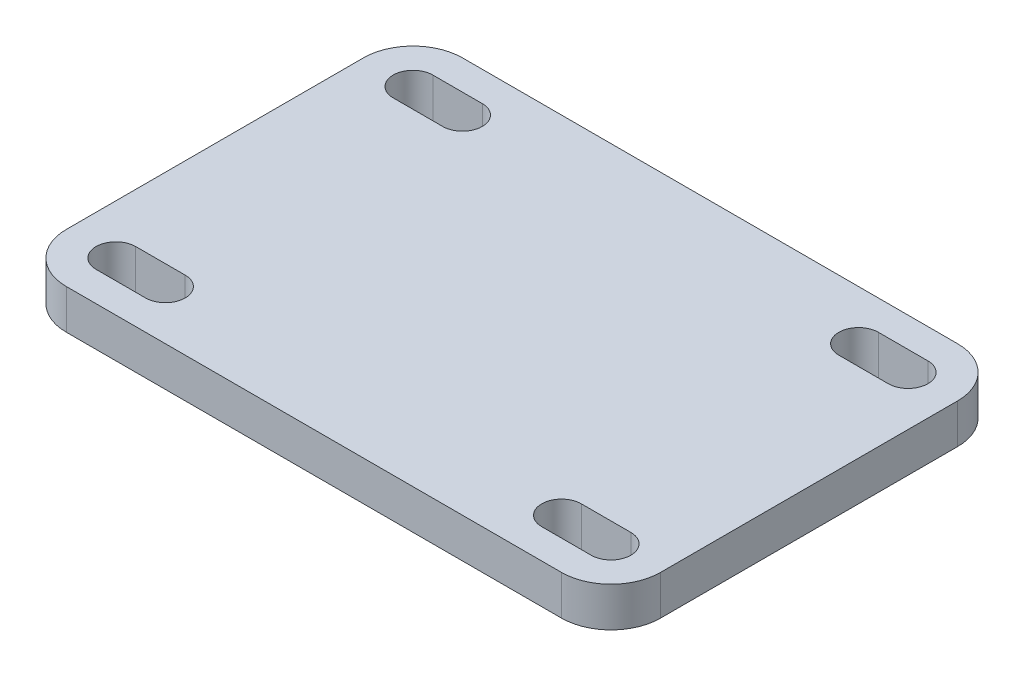
ISO-10303-21;
HEADER;
FILE_DESCRIPTION(('STEP AP214'),'2;1');
FILE_NAME('part.step','',(''),(''),'','','');
FILE_SCHEMA(('AUTOMOTIVE_DESIGN { 1 0 10303 214 1 1 1 1 }'));
ENDSEC;
DATA;
#1=APPLICATION_CONTEXT('core data for automotive mechanical design processes');
#2=APPLICATION_PROTOCOL_DEFINITION('international standard','automotive_design',2000,#1);
#3=PRODUCT_CONTEXT('',#1,'mechanical');
#4=PRODUCT('Part','Part','',(#3));
#5=PRODUCT_RELATED_PRODUCT_CATEGORY('part','',(#4));
#6=PRODUCT_DEFINITION_FORMATION('','',#4);
#7=PRODUCT_DEFINITION_CONTEXT('part definition',#1,'design');
#8=PRODUCT_DEFINITION('design','',#6,#7);
#9=PRODUCT_DEFINITION_SHAPE('','',#8);
#10=(LENGTH_UNIT() NAMED_UNIT(*) SI_UNIT(.MILLI.,.METRE.));
#11=(NAMED_UNIT(*) PLANE_ANGLE_UNIT() SI_UNIT($,.RADIAN.));
#12=(NAMED_UNIT(*) SI_UNIT($,.STERADIAN.) SOLID_ANGLE_UNIT());
#13=UNCERTAINTY_MEASURE_WITH_UNIT(LENGTH_MEASURE(1.E-05),#10,'distance_accuracy_value','');
#14=(GEOMETRIC_REPRESENTATION_CONTEXT(3) GLOBAL_UNCERTAINTY_ASSIGNED_CONTEXT((#13)) GLOBAL_UNIT_ASSIGNED_CONTEXT((#10,
#11,#12)) REPRESENTATION_CONTEXT('',''));
#15=CARTESIAN_POINT('',(0.,0.,0.));
#16=DIRECTION('',(0.,0.,1.));
#17=DIRECTION('',(1.,0.,0.));
#18=AXIS2_PLACEMENT_3D('',#15,#16,#17);
#19=CARTESIAN_POINT('',(-25.,4.,15.));
#20=DIRECTION('',(0.,-1.,0.));
#21=DIRECTION('',(0.,0.,-1.));
#22=AXIS2_PLACEMENT_3D('',#19,#20,#21);
#23=CYLINDRICAL_SURFACE('',#22,5.);
#24=CARTESIAN_POINT('',(-25.,0.,15.));
#25=DIRECTION('',(0.,1.,0.));
#26=DIRECTION('',(0.,0.,-1.));
#27=AXIS2_PLACEMENT_3D('',#24,#25,#26);
#28=CIRCLE('',#27,5.);
#29=CARTESIAN_POINT('',(-30.,0.,15.));
#30=VERTEX_POINT('',#29);
#31=CARTESIAN_POINT('',(-25.,0.,20.));
#32=VERTEX_POINT('',#31);
#33=EDGE_CURVE('E322',#30,#32,#28,.T.);
#34=ORIENTED_EDGE('',*,*,#33,.T.);
#35=DIRECTION('',(0.,-1.,0.));
#36=VECTOR('',#35,1.);
#37=CARTESIAN_POINT('',(-25.,4.,20.));
#38=LINE('',#37,#36);
#39=CARTESIAN_POINT('',(-25.,4.,20.));
#40=VERTEX_POINT('',#39);
#41=EDGE_CURVE('E11',#40,#32,#38,.T.);
#42=ORIENTED_EDGE('',*,*,#41,.F.);
#43=CARTESIAN_POINT('',(-25.,4.,15.));
#44=DIRECTION('',(0.,1.,0.));
#45=DIRECTION('',(0.,0.,-1.));
#46=AXIS2_PLACEMENT_3D('',#43,#44,#45);
#47=CIRCLE('',#46,5.);
#48=CARTESIAN_POINT('',(-30.,4.,15.));
#49=VERTEX_POINT('',#48);
#50=EDGE_CURVE('E329',#49,#40,#47,.T.);
#51=ORIENTED_EDGE('',*,*,#50,.F.);
#52=DIRECTION('',(0.,-1.,0.));
#53=VECTOR('',#52,1.);
#54=CARTESIAN_POINT('',(-30.,4.,15.));
#55=LINE('',#54,#53);
#56=EDGE_CURVE('E347',#49,#30,#55,.T.);
#57=ORIENTED_EDGE('',*,*,#56,.T.);
#58=EDGE_LOOP('',(#34,#42,#51,#57));
#59=FACE_BOUND('',#58,.T.);
#60=ADVANCED_FACE('F33',(#59),#23,.T.);
#61=CARTESIAN_POINT('',(25.,4.,20.));
#62=DIRECTION('',(0.,0.,-1.));
#63=DIRECTION('',(-1.,0.,0.));
#64=AXIS2_PLACEMENT_3D('',#61,#62,#63);
#65=PLANE('',#64);
#66=DIRECTION('',(1.,0.,0.));
#67=VECTOR('',#66,1.);
#68=CARTESIAN_POINT('',(25.,0.,20.));
#69=LINE('',#68,#67);
#70=CARTESIAN_POINT('',(25.,0.,20.));
#71=VERTEX_POINT('',#70);
#72=EDGE_CURVE('E350',#32,#71,#69,.T.);
#73=ORIENTED_EDGE('',*,*,#72,.T.);
#74=DIRECTION('',(0.,-1.,0.));
#75=VECTOR('',#74,1.);
#76=CARTESIAN_POINT('',(25.,4.,20.));
#77=LINE('',#76,#75);
#78=CARTESIAN_POINT('',(25.,4.,20.));
#79=VERTEX_POINT('',#78);
#80=EDGE_CURVE('E40',#79,#71,#77,.T.);
#81=ORIENTED_EDGE('',*,*,#80,.F.);
#82=DIRECTION('',(1.,0.,0.));
#83=VECTOR('',#82,1.);
#84=CARTESIAN_POINT('',(25.,4.,20.));
#85=LINE('',#84,#83);
#86=EDGE_CURVE('E332',#40,#79,#85,.T.);
#87=ORIENTED_EDGE('',*,*,#86,.F.);
#88=ORIENTED_EDGE('',*,*,#41,.T.);
#89=EDGE_LOOP('',(#73,#81,#87,#88));
#90=FACE_BOUND('',#89,.T.);
#91=ADVANCED_FACE('F406',(#90),#65,.F.);
#92=CARTESIAN_POINT('',(25.,4.,15.));
#93=DIRECTION('',(0.,-1.,0.));
#94=DIRECTION('',(0.,0.,-1.));
#95=AXIS2_PLACEMENT_3D('',#92,#93,#94);
#96=CYLINDRICAL_SURFACE('',#95,5.);
#97=CARTESIAN_POINT('',(25.,0.,15.));
#98=DIRECTION('',(0.,1.,0.));
#99=DIRECTION('',(0.,0.,1.));
#100=AXIS2_PLACEMENT_3D('',#97,#98,#99);
#101=CIRCLE('',#100,5.);
#102=CARTESIAN_POINT('',(30.,0.,15.));
#103=VERTEX_POINT('',#102);
#104=EDGE_CURVE('E352',#71,#103,#101,.T.);
#105=ORIENTED_EDGE('',*,*,#104,.T.);
#106=DIRECTION('',(0.,-1.,0.));
#107=VECTOR('',#106,1.);
#108=CARTESIAN_POINT('',(30.,4.,15.));
#109=LINE('',#108,#107);
#110=CARTESIAN_POINT('',(30.,4.,15.));
#111=VERTEX_POINT('',#110);
#112=EDGE_CURVE('E377',#111,#103,#109,.T.);
#113=ORIENTED_EDGE('',*,*,#112,.F.);
#114=CARTESIAN_POINT('',(25.,4.,15.));
#115=DIRECTION('',(0.,1.,0.));
#116=DIRECTION('',(0.,0.,1.));
#117=AXIS2_PLACEMENT_3D('',#114,#115,#116);
#118=CIRCLE('',#117,5.);
#119=EDGE_CURVE('E335',#79,#111,#118,.T.);
#120=ORIENTED_EDGE('',*,*,#119,.F.);
#121=ORIENTED_EDGE('',*,*,#80,.T.);
#122=EDGE_LOOP('',(#105,#113,#120,#121));
#123=FACE_BOUND('',#122,.T.);
#124=ADVANCED_FACE('F384',(#123),#96,.T.);
#125=CARTESIAN_POINT('',(30.,4.,15.));
#126=DIRECTION('',(-1.,0.,0.));
#127=DIRECTION('',(0.,0.,1.));
#128=AXIS2_PLACEMENT_3D('',#125,#126,#127);
#129=PLANE('',#128);
#130=DIRECTION('',(0.,0.,-1.));
#131=VECTOR('',#130,1.);
#132=CARTESIAN_POINT('',(30.,0.,15.));
#133=LINE('',#132,#131);
#134=CARTESIAN_POINT('',(30.,0.,-15.));
#135=VERTEX_POINT('',#134);
#136=EDGE_CURVE('E354',#103,#135,#133,.T.);
#137=ORIENTED_EDGE('',*,*,#136,.T.);
#138=DIRECTION('',(0.,-1.,0.));
#139=VECTOR('',#138,1.);
#140=CARTESIAN_POINT('',(30.,4.,-15.));
#141=LINE('',#140,#139);
#142=CARTESIAN_POINT('',(30.,4.,-15.));
#143=VERTEX_POINT('',#142);
#144=EDGE_CURVE('E374',#143,#135,#141,.T.);
#145=ORIENTED_EDGE('',*,*,#144,.F.);
#146=DIRECTION('',(0.,0.,-1.));
#147=VECTOR('',#146,1.);
#148=CARTESIAN_POINT('',(30.,4.,15.));
#149=LINE('',#148,#147);
#150=EDGE_CURVE('E337',#111,#143,#149,.T.);
#151=ORIENTED_EDGE('',*,*,#150,.F.);
#152=ORIENTED_EDGE('',*,*,#112,.T.);
#153=EDGE_LOOP('',(#137,#145,#151,#152));
#154=FACE_BOUND('',#153,.T.);
#155=ADVANCED_FACE('F394',(#154),#129,.F.);
#156=CARTESIAN_POINT('',(25.,4.,-15.));
#157=DIRECTION('',(0.,-1.,0.));
#158=DIRECTION('',(0.,0.,-1.));
#159=AXIS2_PLACEMENT_3D('',#156,#157,#158);
#160=CYLINDRICAL_SURFACE('',#159,5.);
#161=CARTESIAN_POINT('',(25.,0.,-15.));
#162=DIRECTION('',(0.,1.,0.));
#163=DIRECTION('',(0.,0.,1.));
#164=AXIS2_PLACEMENT_3D('',#161,#162,#163);
#165=CIRCLE('',#164,5.);
#166=CARTESIAN_POINT('',(25.,0.,-20.));
#167=VERTEX_POINT('',#166);
#168=EDGE_CURVE('E356',#135,#167,#165,.T.);
#169=ORIENTED_EDGE('',*,*,#168,.T.);
#170=DIRECTION('',(0.,-1.,0.));
#171=VECTOR('',#170,1.);
#172=CARTESIAN_POINT('',(25.,4.,-20.));
#173=LINE('',#172,#171);
#174=CARTESIAN_POINT('',(25.,4.,-20.));
#175=VERTEX_POINT('',#174);
#176=EDGE_CURVE('E371',#175,#167,#173,.T.);
#177=ORIENTED_EDGE('',*,*,#176,.F.);
#178=CARTESIAN_POINT('',(25.,4.,-15.));
#179=DIRECTION('',(0.,1.,0.));
#180=DIRECTION('',(0.,0.,1.));
#181=AXIS2_PLACEMENT_3D('',#178,#179,#180);
#182=CIRCLE('',#181,5.);
#183=EDGE_CURVE('E339',#143,#175,#182,.T.);
#184=ORIENTED_EDGE('',*,*,#183,.F.);
#185=ORIENTED_EDGE('',*,*,#144,.T.);
#186=EDGE_LOOP('',(#169,#177,#184,#185));
#187=FACE_BOUND('',#186,.T.);
#188=ADVANCED_FACE('F398',(#187),#160,.T.);
#189=CARTESIAN_POINT('',(25.,4.,-20.));
#190=DIRECTION('',(0.,0.,1.));
#191=DIRECTION('',(1.,0.,0.));
#192=AXIS2_PLACEMENT_3D('',#189,#190,#191);
#193=PLANE('',#192);
#194=DIRECTION('',(-1.,0.,0.));
#195=VECTOR('',#194,1.);
#196=CARTESIAN_POINT('',(25.,0.,-20.));
#197=LINE('',#196,#195);
#198=CARTESIAN_POINT('',(-25.,0.,-20.));
#199=VERTEX_POINT('',#198);
#200=EDGE_CURVE('E358',#167,#199,#197,.T.);
#201=ORIENTED_EDGE('',*,*,#200,.T.);
#202=DIRECTION('',(0.,-1.,0.));
#203=VECTOR('',#202,1.);
#204=CARTESIAN_POINT('',(-25.,4.,-20.));
#205=LINE('',#204,#203);
#206=CARTESIAN_POINT('',(-25.,4.,-20.));
#207=VERTEX_POINT('',#206);
#208=EDGE_CURVE('E368',#207,#199,#205,.T.);
#209=ORIENTED_EDGE('',*,*,#208,.F.);
#210=DIRECTION('',(-1.,0.,0.));
#211=VECTOR('',#210,1.);
#212=CARTESIAN_POINT('',(25.,4.,-20.));
#213=LINE('',#212,#211);
#214=EDGE_CURVE('E341',#175,#207,#213,.T.);
#215=ORIENTED_EDGE('',*,*,#214,.F.);
#216=ORIENTED_EDGE('',*,*,#176,.T.);
#217=EDGE_LOOP('',(#201,#209,#215,#216));
#218=FACE_BOUND('',#217,.T.);
#219=ADVANCED_FACE('F419',(#218),#193,.F.);
#220=CARTESIAN_POINT('',(-25.,4.,-15.));
#221=DIRECTION('',(0.,-1.,0.));
#222=DIRECTION('',(0.,0.,-1.));
#223=AXIS2_PLACEMENT_3D('',#220,#221,#222);
#224=CYLINDRICAL_SURFACE('',#223,5.);
#225=CARTESIAN_POINT('',(-25.,0.,-15.));
#226=DIRECTION('',(0.,1.,0.));
#227=DIRECTION('',(0.,0.,1.));
#228=AXIS2_PLACEMENT_3D('',#225,#226,#227);
#229=CIRCLE('',#228,5.);
#230=CARTESIAN_POINT('',(-30.,0.,-15.));
#231=VERTEX_POINT('',#230);
#232=EDGE_CURVE('E360',#199,#231,#229,.T.);
#233=ORIENTED_EDGE('',*,*,#232,.T.);
#234=DIRECTION('',(0.,-1.,0.));
#235=VECTOR('',#234,1.);
#236=CARTESIAN_POINT('',(-30.,4.,-15.));
#237=LINE('',#236,#235);
#238=CARTESIAN_POINT('',(-30.,4.,-15.));
#239=VERTEX_POINT('',#238);
#240=EDGE_CURVE('E365',#239,#231,#237,.T.);
#241=ORIENTED_EDGE('',*,*,#240,.F.);
#242=CARTESIAN_POINT('',(-25.,4.,-15.));
#243=DIRECTION('',(0.,1.,0.));
#244=DIRECTION('',(0.,0.,1.));
#245=AXIS2_PLACEMENT_3D('',#242,#243,#244);
#246=CIRCLE('',#245,5.);
#247=EDGE_CURVE('E343',#207,#239,#246,.T.);
#248=ORIENTED_EDGE('',*,*,#247,.F.);
#249=ORIENTED_EDGE('',*,*,#208,.T.);
#250=EDGE_LOOP('',(#233,#241,#248,#249));
#251=FACE_BOUND('',#250,.T.);
#252=ADVANCED_FACE('F417',(#251),#224,.T.);
#253=CARTESIAN_POINT('',(-30.,4.,15.));
#254=DIRECTION('',(1.,0.,0.));
#255=DIRECTION('',(0.,0.,-1.));
#256=AXIS2_PLACEMENT_3D('',#253,#254,#255);
#257=PLANE('',#256);
#258=DIRECTION('',(0.,0.,1.));
#259=VECTOR('',#258,1.);
#260=CARTESIAN_POINT('',(-30.,0.,15.));
#261=LINE('',#260,#259);
#262=EDGE_CURVE('E333',#231,#30,#261,.T.);
#263=ORIENTED_EDGE('',*,*,#262,.T.);
#264=ORIENTED_EDGE('',*,*,#56,.F.);
#265=DIRECTION('',(0.,0.,1.));
#266=VECTOR('',#265,1.);
#267=CARTESIAN_POINT('',(-30.,4.,15.));
#268=LINE('',#267,#266);
#269=EDGE_CURVE('E345',#239,#49,#268,.T.);
#270=ORIENTED_EDGE('',*,*,#269,.F.);
#271=ORIENTED_EDGE('',*,*,#240,.T.);
#272=EDGE_LOOP('',(#263,#264,#270,#271));
#273=FACE_BOUND('',#272,.T.);
#274=ADVANCED_FACE('F412',(#273),#257,.F.);
#275=CARTESIAN_POINT('',(-25.,4.,15.));
#276=DIRECTION('',(0.,-1.,0.));
#277=DIRECTION('',(0.,0.,-1.));
#278=AXIS2_PLACEMENT_3D('',#275,#276,#277);
#279=PLANE('',#278);
#280=DIRECTION('',(1.,0.,0.));
#281=VECTOR('',#280,1.);
#282=CARTESIAN_POINT('',(-25.,4.,17.));
#283=LINE('',#282,#281);
#284=CARTESIAN_POINT('',(-25.,4.,17.));
#285=VERTEX_POINT('',#284);
#286=CARTESIAN_POINT('',(-20.,4.,17.));
#287=VERTEX_POINT('',#286);
#288=EDGE_CURVE('E283',#285,#287,#283,.T.);
#289=ORIENTED_EDGE('',*,*,#288,.F.);
#290=CARTESIAN_POINT('',(-25.,4.,15.));
#291=DIRECTION('',(0.,1.,0.));
#292=DIRECTION('',(0.,0.,-1.));
#293=AXIS2_PLACEMENT_3D('',#290,#291,#292);
#294=CIRCLE('',#293,2.);
#295=CARTESIAN_POINT('',(-25.,4.,13.));
#296=VERTEX_POINT('',#295);
#297=EDGE_CURVE('E47',#296,#285,#294,.T.);
#298=ORIENTED_EDGE('',*,*,#297,.F.);
#299=DIRECTION('',(-1.,0.,0.));
#300=VECTOR('',#299,1.);
#301=CARTESIAN_POINT('',(-25.,4.,13.));
#302=LINE('',#301,#300);
#303=CARTESIAN_POINT('',(-20.,4.,13.));
#304=VERTEX_POINT('',#303);
#305=EDGE_CURVE('E272',#304,#296,#302,.T.);
#306=ORIENTED_EDGE('',*,*,#305,.F.);
#307=CARTESIAN_POINT('',(-20.,4.,15.));
#308=DIRECTION('',(0.,1.,0.));
#309=DIRECTION('',(0.,0.,-1.));
#310=AXIS2_PLACEMENT_3D('',#307,#308,#309);
#311=CIRCLE('',#310,2.);
#312=EDGE_CURVE('E286',#287,#304,#311,.T.);
#313=ORIENTED_EDGE('',*,*,#312,.F.);
#314=EDGE_LOOP('',(#289,#298,#306,#313));
#315=FACE_BOUND('',#314,.T.);
#316=DIRECTION('',(-1.,0.,0.));
#317=VECTOR('',#316,1.);
#318=CARTESIAN_POINT('',(25.,4.,13.));
#319=LINE('',#318,#317);
#320=CARTESIAN_POINT('',(25.,4.,13.));
#321=VERTEX_POINT('',#320);
#322=CARTESIAN_POINT('',(20.,4.,13.));
#323=VERTEX_POINT('',#322);
#324=EDGE_CURVE('E253',#321,#323,#319,.T.);
#325=ORIENTED_EDGE('',*,*,#324,.F.);
#326=CARTESIAN_POINT('',(25.,4.,15.));
#327=DIRECTION('',(0.,1.,0.));
#328=DIRECTION('',(0.,0.,1.));
#329=AXIS2_PLACEMENT_3D('',#326,#327,#328);
#330=CIRCLE('',#329,2.);
#331=CARTESIAN_POINT('',(25.,4.,17.));
#332=VERTEX_POINT('',#331);
#333=EDGE_CURVE('E55',#332,#321,#330,.T.);
#334=ORIENTED_EDGE('',*,*,#333,.F.);
#335=DIRECTION('',(1.,0.,0.));
#336=VECTOR('',#335,1.);
#337=CARTESIAN_POINT('',(25.,4.,17.));
#338=LINE('',#337,#336);
#339=CARTESIAN_POINT('',(20.,4.,17.));
#340=VERTEX_POINT('',#339);
#341=EDGE_CURVE('E242',#340,#332,#338,.T.);
#342=ORIENTED_EDGE('',*,*,#341,.F.);
#343=CARTESIAN_POINT('',(20.,4.,15.));
#344=DIRECTION('',(0.,1.,0.));
#345=DIRECTION('',(0.,0.,1.));
#346=AXIS2_PLACEMENT_3D('',#343,#344,#345);
#347=CIRCLE('',#346,2.);
#348=EDGE_CURVE('E257',#323,#340,#347,.T.);
#349=ORIENTED_EDGE('',*,*,#348,.F.);
#350=EDGE_LOOP('',(#325,#334,#342,#349));
#351=FACE_BOUND('',#350,.T.);
#352=DIRECTION('',(-1.,0.,0.));
#353=VECTOR('',#352,1.);
#354=CARTESIAN_POINT('',(25.,4.,-17.));
#355=LINE('',#354,#353);
#356=CARTESIAN_POINT('',(25.,4.,-17.));
#357=VERTEX_POINT('',#356);
#358=CARTESIAN_POINT('',(20.,4.,-17.));
#359=VERTEX_POINT('',#358);
#360=EDGE_CURVE('E227',#357,#359,#355,.T.);
#361=ORIENTED_EDGE('',*,*,#360,.F.);
#362=CARTESIAN_POINT('',(25.,4.,-15.));
#363=DIRECTION('',(0.,1.,0.));
#364=DIRECTION('',(0.,0.,-1.));
#365=AXIS2_PLACEMENT_3D('',#362,#363,#364);
#366=CIRCLE('',#365,2.);
#367=CARTESIAN_POINT('',(25.,4.,-13.));
#368=VERTEX_POINT('',#367);
#369=EDGE_CURVE('E200',#368,#357,#366,.T.);
#370=ORIENTED_EDGE('',*,*,#369,.F.);
#371=DIRECTION('',(1.,0.,0.));
#372=VECTOR('',#371,1.);
#373=CARTESIAN_POINT('',(25.,4.,-13.));
#374=LINE('',#373,#372);
#375=CARTESIAN_POINT('',(20.,4.,-13.));
#376=VERTEX_POINT('',#375);
#377=EDGE_CURVE('E218',#376,#368,#374,.T.);
#378=ORIENTED_EDGE('',*,*,#377,.F.);
#379=CARTESIAN_POINT('',(20.,4.,-15.));
#380=DIRECTION('',(0.,1.,0.));
#381=DIRECTION('',(0.,0.,-1.));
#382=AXIS2_PLACEMENT_3D('',#379,#380,#381);
#383=CIRCLE('',#382,2.);
#384=EDGE_CURVE('E221',#359,#376,#383,.T.);
#385=ORIENTED_EDGE('',*,*,#384,.F.);
#386=EDGE_LOOP('',(#361,#370,#378,#385));
#387=FACE_BOUND('',#386,.T.);
#388=DIRECTION('',(1.,0.,0.));
#389=VECTOR('',#388,1.);
#390=CARTESIAN_POINT('',(-25.,4.,-13.));
#391=LINE('',#390,#389);
#392=CARTESIAN_POINT('',(-25.,4.,-13.));
#393=VERTEX_POINT('',#392);
#394=CARTESIAN_POINT('',(-20.,4.,-13.));
#395=VERTEX_POINT('',#394);
#396=EDGE_CURVE('E312',#393,#395,#391,.T.);
#397=ORIENTED_EDGE('',*,*,#396,.F.);
#398=CARTESIAN_POINT('',(-25.,4.,-15.));
#399=DIRECTION('',(0.,1.,0.));
#400=DIRECTION('',(0.,0.,1.));
#401=AXIS2_PLACEMENT_3D('',#398,#399,#400);
#402=CIRCLE('',#401,2.);
#403=CARTESIAN_POINT('',(-25.,4.,-17.));
#404=VERTEX_POINT('',#403);
#405=EDGE_CURVE('E234',#404,#393,#402,.T.);
#406=ORIENTED_EDGE('',*,*,#405,.F.);
#407=DIRECTION('',(-1.,0.,0.));
#408=VECTOR('',#407,1.);
#409=CARTESIAN_POINT('',(-25.,4.,-17.));
#410=LINE('',#409,#408);
#411=CARTESIAN_POINT('',(-20.,4.,-17.));
#412=VERTEX_POINT('',#411);
#413=EDGE_CURVE('E301',#412,#404,#410,.T.);
#414=ORIENTED_EDGE('',*,*,#413,.F.);
#415=CARTESIAN_POINT('',(-20.,4.,-15.));
#416=DIRECTION('',(0.,1.,0.));
#417=DIRECTION('',(0.,0.,1.));
#418=AXIS2_PLACEMENT_3D('',#415,#416,#417);
#419=CIRCLE('',#418,2.);
#420=EDGE_CURVE('E315',#395,#412,#419,.T.);
#421=ORIENTED_EDGE('',*,*,#420,.F.);
#422=EDGE_LOOP('',(#397,#406,#414,#421));
#423=FACE_BOUND('',#422,.T.);
#424=ORIENTED_EDGE('',*,*,#50,.T.);
#425=ORIENTED_EDGE('',*,*,#86,.T.);
#426=ORIENTED_EDGE('',*,*,#119,.T.);
#427=ORIENTED_EDGE('',*,*,#150,.T.);
#428=ORIENTED_EDGE('',*,*,#183,.T.);
#429=ORIENTED_EDGE('',*,*,#214,.T.);
#430=ORIENTED_EDGE('',*,*,#247,.T.);
#431=ORIENTED_EDGE('',*,*,#269,.T.);
#432=EDGE_LOOP('',(#424,#425,#426,#427,#428,#429,#430,#431));
#433=FACE_BOUND('',#432,.T.);
#434=ADVANCED_FACE('F402',(#315,#351,#387,#423,#433),#279,.F.);
#435=CARTESIAN_POINT('',(-25.,0.,15.));
#436=DIRECTION('',(0.,-1.,0.));
#437=DIRECTION('',(0.,0.,-1.));
#438=AXIS2_PLACEMENT_3D('',#435,#436,#437);
#439=PLANE('',#438);
#440=CARTESIAN_POINT('',(-25.,0.,15.));
#441=DIRECTION('',(0.,1.,0.));
#442=DIRECTION('',(0.,0.,-1.));
#443=AXIS2_PLACEMENT_3D('',#440,#441,#442);
#444=CIRCLE('',#443,2.);
#445=CARTESIAN_POINT('',(-25.,0.,13.));
#446=VERTEX_POINT('',#445);
#447=CARTESIAN_POINT('',(-25.,0.,17.));
#448=VERTEX_POINT('',#447);
#449=EDGE_CURVE('E268',#446,#448,#444,.T.);
#450=ORIENTED_EDGE('',*,*,#449,.T.);
#451=DIRECTION('',(1.,0.,0.));
#452=VECTOR('',#451,1.);
#453=CARTESIAN_POINT('',(-25.,0.,17.));
#454=LINE('',#453,#452);
#455=CARTESIAN_POINT('',(-20.,0.,17.));
#456=VERTEX_POINT('',#455);
#457=EDGE_CURVE('E271',#448,#456,#454,.T.);
#458=ORIENTED_EDGE('',*,*,#457,.T.);
#459=CARTESIAN_POINT('',(-20.,0.,15.));
#460=DIRECTION('',(0.,1.,0.));
#461=DIRECTION('',(0.,0.,-1.));
#462=AXIS2_PLACEMENT_3D('',#459,#460,#461);
#463=CIRCLE('',#462,2.);
#464=CARTESIAN_POINT('',(-20.,0.,13.));
#465=VERTEX_POINT('',#464);
#466=EDGE_CURVE('E275',#456,#465,#463,.T.);
#467=ORIENTED_EDGE('',*,*,#466,.T.);
#468=DIRECTION('',(-1.,0.,0.));
#469=VECTOR('',#468,1.);
#470=CARTESIAN_POINT('',(-25.,0.,13.));
#471=LINE('',#470,#469);
#472=EDGE_CURVE('E278',#465,#446,#471,.T.);
#473=ORIENTED_EDGE('',*,*,#472,.T.);
#474=EDGE_LOOP('',(#450,#458,#467,#473));
#475=FACE_BOUND('',#474,.T.);
#476=CARTESIAN_POINT('',(25.,0.,15.));
#477=DIRECTION('',(0.,1.,0.));
#478=DIRECTION('',(0.,0.,1.));
#479=AXIS2_PLACEMENT_3D('',#476,#477,#478);
#480=CIRCLE('',#479,2.);
#481=CARTESIAN_POINT('',(25.,0.,17.));
#482=VERTEX_POINT('',#481);
#483=CARTESIAN_POINT('',(25.,0.,13.));
#484=VERTEX_POINT('',#483);
#485=EDGE_CURVE('E238',#482,#484,#480,.T.);
#486=ORIENTED_EDGE('',*,*,#485,.T.);
#487=DIRECTION('',(-1.,0.,0.));
#488=VECTOR('',#487,1.);
#489=CARTESIAN_POINT('',(25.,0.,13.));
#490=LINE('',#489,#488);
#491=CARTESIAN_POINT('',(20.,0.,13.));
#492=VERTEX_POINT('',#491);
#493=EDGE_CURVE('E241',#484,#492,#490,.T.);
#494=ORIENTED_EDGE('',*,*,#493,.T.);
#495=CARTESIAN_POINT('',(20.,0.,15.));
#496=DIRECTION('',(0.,1.,0.));
#497=DIRECTION('',(0.,0.,1.));
#498=AXIS2_PLACEMENT_3D('',#495,#496,#497);
#499=CIRCLE('',#498,2.);
#500=CARTESIAN_POINT('',(20.,0.,17.));
#501=VERTEX_POINT('',#500);
#502=EDGE_CURVE('E245',#492,#501,#499,.T.);
#503=ORIENTED_EDGE('',*,*,#502,.T.);
#504=DIRECTION('',(1.,0.,0.));
#505=VECTOR('',#504,1.);
#506=CARTESIAN_POINT('',(25.,0.,17.));
#507=LINE('',#506,#505);
#508=EDGE_CURVE('E248',#501,#482,#507,.T.);
#509=ORIENTED_EDGE('',*,*,#508,.T.);
#510=EDGE_LOOP('',(#486,#494,#503,#509));
#511=FACE_BOUND('',#510,.T.);
#512=CARTESIAN_POINT('',(25.,0.,-15.));
#513=DIRECTION('',(0.,1.,0.));
#514=DIRECTION('',(0.,0.,-1.));
#515=AXIS2_PLACEMENT_3D('',#512,#513,#514);
#516=CIRCLE('',#515,2.);
#517=CARTESIAN_POINT('',(25.,0.,-13.));
#518=VERTEX_POINT('',#517);
#519=CARTESIAN_POINT('',(25.,0.,-17.));
#520=VERTEX_POINT('',#519);
#521=EDGE_CURVE('E197',#518,#520,#516,.T.);
#522=ORIENTED_EDGE('',*,*,#521,.T.);
#523=DIRECTION('',(-1.,0.,0.));
#524=VECTOR('',#523,1.);
#525=CARTESIAN_POINT('',(25.,0.,-17.));
#526=LINE('',#525,#524);
#527=CARTESIAN_POINT('',(20.,0.,-17.));
#528=VERTEX_POINT('',#527);
#529=EDGE_CURVE('E209',#520,#528,#526,.T.);
#530=ORIENTED_EDGE('',*,*,#529,.T.);
#531=CARTESIAN_POINT('',(20.,0.,-15.));
#532=DIRECTION('',(0.,1.,0.));
#533=DIRECTION('',(0.,0.,-1.));
#534=AXIS2_PLACEMENT_3D('',#531,#532,#533);
#535=CIRCLE('',#534,2.);
#536=CARTESIAN_POINT('',(20.,0.,-13.));
#537=VERTEX_POINT('',#536);
#538=EDGE_CURVE('E213',#528,#537,#535,.T.);
#539=ORIENTED_EDGE('',*,*,#538,.T.);
#540=DIRECTION('',(1.,0.,0.));
#541=VECTOR('',#540,1.);
#542=CARTESIAN_POINT('',(25.,0.,-13.));
#543=LINE('',#542,#541);
#544=EDGE_CURVE('E205',#537,#518,#543,.T.);
#545=ORIENTED_EDGE('',*,*,#544,.T.);
#546=EDGE_LOOP('',(#522,#530,#539,#545));
#547=FACE_BOUND('',#546,.T.);
#548=CARTESIAN_POINT('',(-25.,0.,-15.));
#549=DIRECTION('',(0.,1.,0.));
#550=DIRECTION('',(0.,0.,1.));
#551=AXIS2_PLACEMENT_3D('',#548,#549,#550);
#552=CIRCLE('',#551,2.);
#553=CARTESIAN_POINT('',(-25.,0.,-17.));
#554=VERTEX_POINT('',#553);
#555=CARTESIAN_POINT('',(-25.,0.,-13.));
#556=VERTEX_POINT('',#555);
#557=EDGE_CURVE('E297',#554,#556,#552,.T.);
#558=ORIENTED_EDGE('',*,*,#557,.T.);
#559=DIRECTION('',(1.,0.,0.));
#560=VECTOR('',#559,1.);
#561=CARTESIAN_POINT('',(-25.,0.,-13.));
#562=LINE('',#561,#560);
#563=CARTESIAN_POINT('',(-20.,0.,-13.));
#564=VERTEX_POINT('',#563);
#565=EDGE_CURVE('E300',#556,#564,#562,.T.);
#566=ORIENTED_EDGE('',*,*,#565,.T.);
#567=CARTESIAN_POINT('',(-20.,0.,-15.));
#568=DIRECTION('',(0.,1.,0.));
#569=DIRECTION('',(0.,0.,1.));
#570=AXIS2_PLACEMENT_3D('',#567,#568,#569);
#571=CIRCLE('',#570,2.);
#572=CARTESIAN_POINT('',(-20.,0.,-17.));
#573=VERTEX_POINT('',#572);
#574=EDGE_CURVE('E304',#564,#573,#571,.T.);
#575=ORIENTED_EDGE('',*,*,#574,.T.);
#576=DIRECTION('',(-1.,0.,0.));
#577=VECTOR('',#576,1.);
#578=CARTESIAN_POINT('',(-25.,0.,-17.));
#579=LINE('',#578,#577);
#580=EDGE_CURVE('E307',#573,#554,#579,.T.);
#581=ORIENTED_EDGE('',*,*,#580,.T.);
#582=EDGE_LOOP('',(#558,#566,#575,#581));
#583=FACE_BOUND('',#582,.T.);
#584=ORIENTED_EDGE('',*,*,#33,.F.);
#585=ORIENTED_EDGE('',*,*,#262,.F.);
#586=ORIENTED_EDGE('',*,*,#232,.F.);
#587=ORIENTED_EDGE('',*,*,#200,.F.);
#588=ORIENTED_EDGE('',*,*,#168,.F.);
#589=ORIENTED_EDGE('',*,*,#136,.F.);
#590=ORIENTED_EDGE('',*,*,#104,.F.);
#591=ORIENTED_EDGE('',*,*,#72,.F.);
#592=EDGE_LOOP('',(#584,#585,#586,#587,#588,#589,#590,#591));
#593=FACE_BOUND('',#592,.T.);
#594=ADVANCED_FACE('F215',(#475,#511,#547,#583,#593),#439,.T.);
#595=CARTESIAN_POINT('',(-25.,0.,-15.));
#596=DIRECTION('',(0.,1.,0.));
#597=DIRECTION('',(0.,0.,1.));
#598=AXIS2_PLACEMENT_3D('',#595,#596,#597);
#599=CYLINDRICAL_SURFACE('',#598,2.);
#600=ORIENTED_EDGE('',*,*,#405,.T.);
#601=DIRECTION('',(0.,1.,0.));
#602=VECTOR('',#601,1.);
#603=CARTESIAN_POINT('',(-25.,0.,-13.));
#604=LINE('',#603,#602);
#605=EDGE_CURVE('E310',#556,#393,#604,.T.);
#606=ORIENTED_EDGE('',*,*,#605,.F.);
#607=ORIENTED_EDGE('',*,*,#557,.F.);
#608=DIRECTION('',(0.,1.,0.));
#609=VECTOR('',#608,1.);
#610=CARTESIAN_POINT('',(-25.,0.,-17.));
#611=LINE('',#610,#609);
#612=EDGE_CURVE('E320',#554,#404,#611,.T.);
#613=ORIENTED_EDGE('',*,*,#612,.T.);
#614=EDGE_LOOP('',(#600,#606,#607,#613));
#615=FACE_BOUND('',#614,.T.);
#616=ADVANCED_FACE('F482',(#615),#599,.F.);
#617=CARTESIAN_POINT('',(-25.,0.,-17.));
#618=DIRECTION('',(0.,0.,-1.));
#619=DIRECTION('',(-1.,0.,0.));
#620=AXIS2_PLACEMENT_3D('',#617,#618,#619);
#621=PLANE('',#620);
#622=ORIENTED_EDGE('',*,*,#413,.T.);
#623=ORIENTED_EDGE('',*,*,#612,.F.);
#624=ORIENTED_EDGE('',*,*,#580,.F.);
#625=DIRECTION('',(0.,1.,0.));
#626=VECTOR('',#625,1.);
#627=CARTESIAN_POINT('',(-20.,0.,-17.));
#628=LINE('',#627,#626);
#629=EDGE_CURVE('E323',#573,#412,#628,.T.);
#630=ORIENTED_EDGE('',*,*,#629,.T.);
#631=EDGE_LOOP('',(#622,#623,#624,#630));
#632=FACE_BOUND('',#631,.T.);
#633=ADVANCED_FACE('F492',(#632),#621,.F.);
#634=CARTESIAN_POINT('',(-20.,0.,-15.));
#635=DIRECTION('',(0.,1.,0.));
#636=DIRECTION('',(0.,0.,1.));
#637=AXIS2_PLACEMENT_3D('',#634,#635,#636);
#638=CYLINDRICAL_SURFACE('',#637,2.);
#639=ORIENTED_EDGE('',*,*,#420,.T.);
#640=ORIENTED_EDGE('',*,*,#629,.F.);
#641=ORIENTED_EDGE('',*,*,#574,.F.);
#642=DIRECTION('',(0.,1.,0.));
#643=VECTOR('',#642,1.);
#644=CARTESIAN_POINT('',(-20.,0.,-13.));
#645=LINE('',#644,#643);
#646=EDGE_CURVE('E325',#564,#395,#645,.T.);
#647=ORIENTED_EDGE('',*,*,#646,.T.);
#648=EDGE_LOOP('',(#639,#640,#641,#647));
#649=FACE_BOUND('',#648,.T.);
#650=ADVANCED_FACE('F502',(#649),#638,.F.);
#651=CARTESIAN_POINT('',(-25.,0.,-13.));
#652=DIRECTION('',(0.,0.,1.));
#653=DIRECTION('',(1.,0.,0.));
#654=AXIS2_PLACEMENT_3D('',#651,#652,#653);
#655=PLANE('',#654);
#656=ORIENTED_EDGE('',*,*,#396,.T.);
#657=ORIENTED_EDGE('',*,*,#646,.F.);
#658=ORIENTED_EDGE('',*,*,#565,.F.);
#659=ORIENTED_EDGE('',*,*,#605,.T.);
#660=EDGE_LOOP('',(#656,#657,#658,#659));
#661=FACE_BOUND('',#660,.T.);
#662=ADVANCED_FACE('F512',(#661),#655,.F.);
#663=CARTESIAN_POINT('',(25.,0.,-15.));
#664=DIRECTION('',(0.,1.,0.));
#665=DIRECTION('',(0.,0.,1.));
#666=AXIS2_PLACEMENT_3D('',#663,#664,#665);
#667=CYLINDRICAL_SURFACE('',#666,2.);
#668=ORIENTED_EDGE('',*,*,#369,.T.);
#669=DIRECTION('',(0.,1.,0.));
#670=VECTOR('',#669,1.);
#671=CARTESIAN_POINT('',(25.,0.,-17.));
#672=LINE('',#671,#670);
#673=EDGE_CURVE('E193',#520,#357,#672,.T.);
#674=ORIENTED_EDGE('',*,*,#673,.F.);
#675=ORIENTED_EDGE('',*,*,#521,.F.);
#676=DIRECTION('',(0.,1.,0.));
#677=VECTOR('',#676,1.);
#678=CARTESIAN_POINT('',(25.,0.,-13.));
#679=LINE('',#678,#677);
#680=EDGE_CURVE('E232',#518,#368,#679,.T.);
#681=ORIENTED_EDGE('',*,*,#680,.T.);
#682=EDGE_LOOP('',(#668,#674,#675,#681));
#683=FACE_BOUND('',#682,.T.);
#684=ADVANCED_FACE('F195',(#683),#667,.F.);
#685=CARTESIAN_POINT('',(25.,0.,-13.));
#686=DIRECTION('',(0.,0.,1.));
#687=DIRECTION('',(1.,0.,0.));
#688=AXIS2_PLACEMENT_3D('',#685,#686,#687);
#689=PLANE('',#688);
#690=ORIENTED_EDGE('',*,*,#377,.T.);
#691=ORIENTED_EDGE('',*,*,#680,.F.);
#692=ORIENTED_EDGE('',*,*,#544,.F.);
#693=DIRECTION('',(0.,1.,0.));
#694=VECTOR('',#693,1.);
#695=CARTESIAN_POINT('',(20.,0.,-13.));
#696=LINE('',#695,#694);
#697=EDGE_CURVE('E235',#537,#376,#696,.T.);
#698=ORIENTED_EDGE('',*,*,#697,.T.);
#699=EDGE_LOOP('',(#690,#691,#692,#698));
#700=FACE_BOUND('',#699,.T.);
#701=ADVANCED_FACE('F531',(#700),#689,.F.);
#702=CARTESIAN_POINT('',(20.,0.,-15.));
#703=DIRECTION('',(0.,1.,0.));
#704=DIRECTION('',(0.,0.,1.));
#705=AXIS2_PLACEMENT_3D('',#702,#703,#704);
#706=CYLINDRICAL_SURFACE('',#705,2.);
#707=ORIENTED_EDGE('',*,*,#384,.T.);
#708=ORIENTED_EDGE('',*,*,#697,.F.);
#709=ORIENTED_EDGE('',*,*,#538,.F.);
#710=DIRECTION('',(0.,1.,0.));
#711=VECTOR('',#710,1.);
#712=CARTESIAN_POINT('',(20.,0.,-17.));
#713=LINE('',#712,#711);
#714=EDGE_CURVE('E204',#528,#359,#713,.T.);
#715=ORIENTED_EDGE('',*,*,#714,.T.);
#716=EDGE_LOOP('',(#707,#708,#709,#715));
#717=FACE_BOUND('',#716,.T.);
#718=ADVANCED_FACE('F540',(#717),#706,.F.);
#719=CARTESIAN_POINT('',(25.,0.,-17.));
#720=DIRECTION('',(0.,0.,-1.));
#721=DIRECTION('',(-1.,0.,0.));
#722=AXIS2_PLACEMENT_3D('',#719,#720,#721);
#723=PLANE('',#722);
#724=ORIENTED_EDGE('',*,*,#360,.T.);
#725=ORIENTED_EDGE('',*,*,#714,.F.);
#726=ORIENTED_EDGE('',*,*,#529,.F.);
#727=ORIENTED_EDGE('',*,*,#673,.T.);
#728=EDGE_LOOP('',(#724,#725,#726,#727));
#729=FACE_BOUND('',#728,.T.);
#730=ADVANCED_FACE('F210',(#729),#723,.F.);
#731=CARTESIAN_POINT('',(25.,0.,15.));
#732=DIRECTION('',(0.,1.,0.));
#733=DIRECTION('',(0.,0.,1.));
#734=AXIS2_PLACEMENT_3D('',#731,#732,#733);
#735=CYLINDRICAL_SURFACE('',#734,2.);
#736=ORIENTED_EDGE('',*,*,#333,.T.);
#737=DIRECTION('',(0.,1.,0.));
#738=VECTOR('',#737,1.);
#739=CARTESIAN_POINT('',(25.,0.,13.));
#740=LINE('',#739,#738);
#741=EDGE_CURVE('E251',#484,#321,#740,.T.);
#742=ORIENTED_EDGE('',*,*,#741,.F.);
#743=ORIENTED_EDGE('',*,*,#485,.F.);
#744=DIRECTION('',(0.,1.,0.));
#745=VECTOR('',#744,1.);
#746=CARTESIAN_POINT('',(25.,0.,17.));
#747=LINE('',#746,#745);
#748=EDGE_CURVE('E228',#482,#332,#747,.T.);
#749=ORIENTED_EDGE('',*,*,#748,.T.);
#750=EDGE_LOOP('',(#736,#742,#743,#749));
#751=FACE_BOUND('',#750,.T.);
#752=ADVANCED_FACE('F559',(#751),#735,.F.);
#753=CARTESIAN_POINT('',(25.,0.,17.));
#754=DIRECTION('',(0.,0.,1.));
#755=DIRECTION('',(1.,0.,0.));
#756=AXIS2_PLACEMENT_3D('',#753,#754,#755);
#757=PLANE('',#756);
#758=ORIENTED_EDGE('',*,*,#341,.T.);
#759=ORIENTED_EDGE('',*,*,#748,.F.);
#760=ORIENTED_EDGE('',*,*,#508,.F.);
#761=DIRECTION('',(0.,1.,0.));
#762=VECTOR('',#761,1.);
#763=CARTESIAN_POINT('',(20.,0.,17.));
#764=LINE('',#763,#762);
#765=EDGE_CURVE('E263',#501,#340,#764,.T.);
#766=ORIENTED_EDGE('',*,*,#765,.T.);
#767=EDGE_LOOP('',(#758,#759,#760,#766));
#768=FACE_BOUND('',#767,.T.);
#769=ADVANCED_FACE('F568',(#768),#757,.F.);
#770=CARTESIAN_POINT('',(20.,0.,15.));
#771=DIRECTION('',(0.,1.,0.));
#772=DIRECTION('',(0.,0.,1.));
#773=AXIS2_PLACEMENT_3D('',#770,#771,#772);
#774=CYLINDRICAL_SURFACE('',#773,2.);
#775=ORIENTED_EDGE('',*,*,#348,.T.);
#776=ORIENTED_EDGE('',*,*,#765,.F.);
#777=ORIENTED_EDGE('',*,*,#502,.F.);
#778=DIRECTION('',(0.,1.,0.));
#779=VECTOR('',#778,1.);
#780=CARTESIAN_POINT('',(20.,0.,13.));
#781=LINE('',#780,#779);
#782=EDGE_CURVE('E265',#492,#323,#781,.T.);
#783=ORIENTED_EDGE('',*,*,#782,.T.);
#784=EDGE_LOOP('',(#775,#776,#777,#783));
#785=FACE_BOUND('',#784,.T.);
#786=ADVANCED_FACE('F577',(#785),#774,.F.);
#787=CARTESIAN_POINT('',(25.,0.,13.));
#788=DIRECTION('',(0.,0.,-1.));
#789=DIRECTION('',(-1.,0.,0.));
#790=AXIS2_PLACEMENT_3D('',#787,#788,#789);
#791=PLANE('',#790);
#792=ORIENTED_EDGE('',*,*,#324,.T.);
#793=ORIENTED_EDGE('',*,*,#782,.F.);
#794=ORIENTED_EDGE('',*,*,#493,.F.);
#795=ORIENTED_EDGE('',*,*,#741,.T.);
#796=EDGE_LOOP('',(#792,#793,#794,#795));
#797=FACE_BOUND('',#796,.T.);
#798=ADVANCED_FACE('F587',(#797),#791,.F.);
#799=CARTESIAN_POINT('',(-25.,0.,15.));
#800=DIRECTION('',(0.,1.,0.));
#801=DIRECTION('',(0.,0.,1.));
#802=AXIS2_PLACEMENT_3D('',#799,#800,#801);
#803=CYLINDRICAL_SURFACE('',#802,2.);
#804=ORIENTED_EDGE('',*,*,#297,.T.);
#805=DIRECTION('',(0.,1.,0.));
#806=VECTOR('',#805,1.);
#807=CARTESIAN_POINT('',(-25.,0.,17.));
#808=LINE('',#807,#806);
#809=EDGE_CURVE('E281',#448,#285,#808,.T.);
#810=ORIENTED_EDGE('',*,*,#809,.F.);
#811=ORIENTED_EDGE('',*,*,#449,.F.);
#812=DIRECTION('',(0.,1.,0.));
#813=VECTOR('',#812,1.);
#814=CARTESIAN_POINT('',(-25.,0.,13.));
#815=LINE('',#814,#813);
#816=EDGE_CURVE('E254',#446,#296,#815,.T.);
#817=ORIENTED_EDGE('',*,*,#816,.T.);
#818=EDGE_LOOP('',(#804,#810,#811,#817));
#819=FACE_BOUND('',#818,.T.);
#820=ADVANCED_FACE('F597',(#819),#803,.F.);
#821=CARTESIAN_POINT('',(-25.,0.,13.));
#822=DIRECTION('',(0.,0.,-1.));
#823=DIRECTION('',(-1.,0.,0.));
#824=AXIS2_PLACEMENT_3D('',#821,#822,#823);
#825=PLANE('',#824);
#826=ORIENTED_EDGE('',*,*,#305,.T.);
#827=ORIENTED_EDGE('',*,*,#816,.F.);
#828=ORIENTED_EDGE('',*,*,#472,.F.);
#829=DIRECTION('',(0.,1.,0.));
#830=VECTOR('',#829,1.);
#831=CARTESIAN_POINT('',(-20.,0.,13.));
#832=LINE('',#831,#830);
#833=EDGE_CURVE('E292',#465,#304,#832,.T.);
#834=ORIENTED_EDGE('',*,*,#833,.T.);
#835=EDGE_LOOP('',(#826,#827,#828,#834));
#836=FACE_BOUND('',#835,.T.);
#837=ADVANCED_FACE('F607',(#836),#825,.F.);
#838=CARTESIAN_POINT('',(-20.,0.,15.));
#839=DIRECTION('',(0.,1.,0.));
#840=DIRECTION('',(0.,0.,1.));
#841=AXIS2_PLACEMENT_3D('',#838,#839,#840);
#842=CYLINDRICAL_SURFACE('',#841,2.);
#843=ORIENTED_EDGE('',*,*,#312,.T.);
#844=ORIENTED_EDGE('',*,*,#833,.F.);
#845=ORIENTED_EDGE('',*,*,#466,.F.);
#846=DIRECTION('',(0.,1.,0.));
#847=VECTOR('',#846,1.);
#848=CARTESIAN_POINT('',(-20.,0.,17.));
#849=LINE('',#848,#847);
#850=EDGE_CURVE('E294',#456,#287,#849,.T.);
#851=ORIENTED_EDGE('',*,*,#850,.T.);
#852=EDGE_LOOP('',(#843,#844,#845,#851));
#853=FACE_BOUND('',#852,.T.);
#854=ADVANCED_FACE('F616',(#853),#842,.F.);
#855=CARTESIAN_POINT('',(-25.,0.,17.));
#856=DIRECTION('',(0.,0.,1.));
#857=DIRECTION('',(1.,0.,0.));
#858=AXIS2_PLACEMENT_3D('',#855,#856,#857);
#859=PLANE('',#858);
#860=ORIENTED_EDGE('',*,*,#288,.T.);
#861=ORIENTED_EDGE('',*,*,#850,.F.);
#862=ORIENTED_EDGE('',*,*,#457,.F.);
#863=ORIENTED_EDGE('',*,*,#809,.T.);
#864=EDGE_LOOP('',(#860,#861,#862,#863));
#865=FACE_BOUND('',#864,.T.);
#866=ADVANCED_FACE('F626',(#865),#859,.F.);
#867=CLOSED_SHELL('',(#60,#91,#124,#155,#188,#219,#252,#274,#434,#594,#616,#633,#650,#662,#684,
#701,#718,#730,#752,#769,#786,#798,#820,#837,#854,#866));
#868=MANIFOLD_SOLID_BREP('B2',#867);
#869=ADVANCED_BREP_SHAPE_REPRESENTATION('',(#18,#868),#14);
#870=SHAPE_DEFINITION_REPRESENTATION(#9,#869);
ENDSEC;
END-ISO-10303-21;
